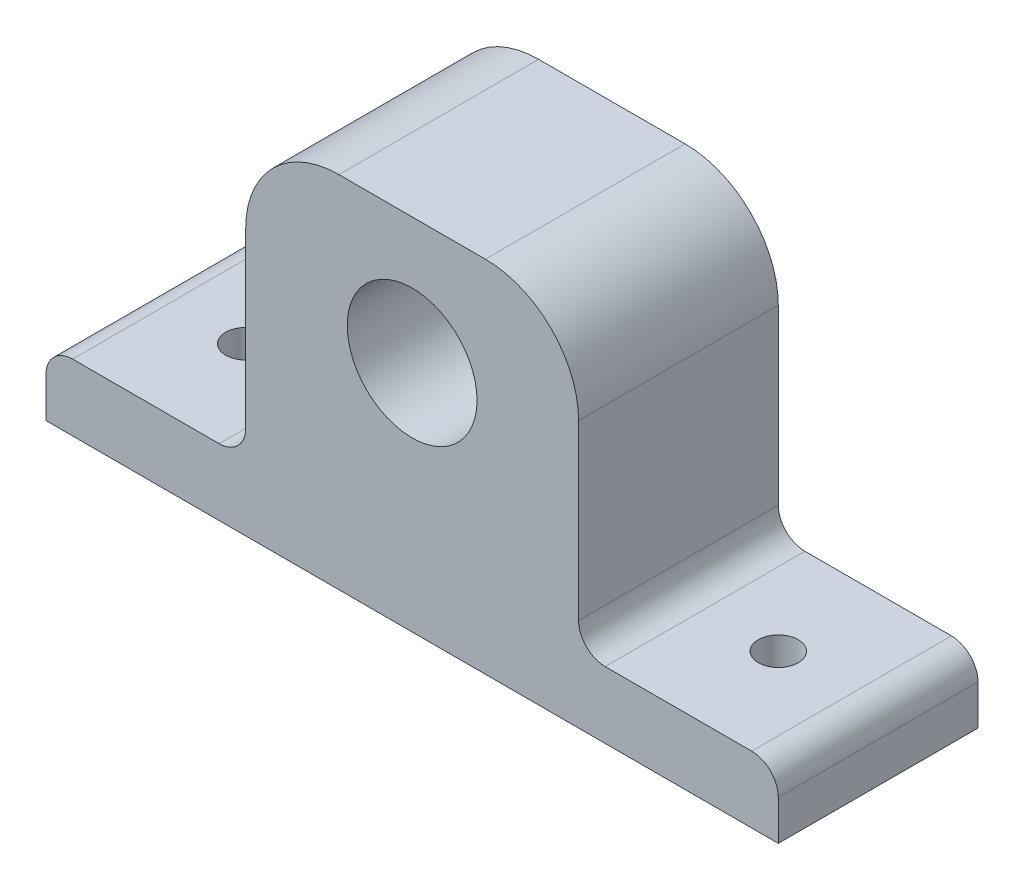
ISO-10303-21;
HEADER;
FILE_DESCRIPTION(('STEP AP214'),'2;1');
FILE_NAME('part.step','',(''),(''),'','','');
FILE_SCHEMA(('AUTOMOTIVE_DESIGN { 1 0 10303 214 1 1 1 1 }'));
ENDSEC;
DATA;
#1=APPLICATION_CONTEXT('core data for automotive mechanical design processes');
#2=APPLICATION_PROTOCOL_DEFINITION('international standard','automotive_design',2000,#1);
#3=PRODUCT_CONTEXT('',#1,'mechanical');
#4=PRODUCT('Part','Part','',(#3));
#5=PRODUCT_RELATED_PRODUCT_CATEGORY('part','',(#4));
#6=PRODUCT_DEFINITION_FORMATION('','',#4);
#7=PRODUCT_DEFINITION_CONTEXT('part definition',#1,'design');
#8=PRODUCT_DEFINITION('design','',#6,#7);
#9=PRODUCT_DEFINITION_SHAPE('','',#8);
#10=(LENGTH_UNIT() NAMED_UNIT(*) SI_UNIT(.MILLI.,.METRE.));
#11=(NAMED_UNIT(*) PLANE_ANGLE_UNIT() SI_UNIT($,.RADIAN.));
#12=(NAMED_UNIT(*) SI_UNIT($,.STERADIAN.) SOLID_ANGLE_UNIT());
#13=UNCERTAINTY_MEASURE_WITH_UNIT(LENGTH_MEASURE(1.E-05),#10,'distance_accuracy_value','');
#14=(GEOMETRIC_REPRESENTATION_CONTEXT(3) GLOBAL_UNCERTAINTY_ASSIGNED_CONTEXT((#13)) GLOBAL_UNIT_ASSIGNED_CONTEXT((#10,
#11,#12)) REPRESENTATION_CONTEXT('',''));
#15=CARTESIAN_POINT('',(0.,0.,0.));
#16=DIRECTION('',(0.,0.,1.));
#17=DIRECTION('',(1.,0.,0.));
#18=AXIS2_PLACEMENT_3D('',#15,#16,#17);
#19=CARTESIAN_POINT('',(-27.5,27.,7.5));
#20=DIRECTION('',(1.,0.,0.));
#21=DIRECTION('',(0.,0.,-1.));
#22=AXIS2_PLACEMENT_3D('',#19,#20,#21);
#23=PLANE('',#22);
#24=DIRECTION('',(0.,-1.,0.));
#25=VECTOR('',#24,1.);
#26=CARTESIAN_POINT('',(-27.5,27.,7.5));
#27=LINE('',#26,#25);
#28=CARTESIAN_POINT('',(-27.5,3.,7.5));
#29=VERTEX_POINT('',#28);
#30=CARTESIAN_POINT('',(-27.5,0.,7.5));
#31=VERTEX_POINT('',#30);
#32=EDGE_CURVE('E193',#29,#31,#27,.T.);
#33=ORIENTED_EDGE('',*,*,#32,.F.);
#34=DIRECTION('',(0.,0.,1.));
#35=VECTOR('',#34,1.);
#36=CARTESIAN_POINT('',(-27.5,3.,-7.5));
#37=LINE('',#36,#35);
#38=CARTESIAN_POINT('',(-27.5,3.,-7.5));
#39=VERTEX_POINT('',#38);
#40=EDGE_CURVE('E237',#29,#39,#37,.F.);
#41=ORIENTED_EDGE('',*,*,#40,.T.);
#42=DIRECTION('',(0.,-1.,0.));
#43=VECTOR('',#42,1.);
#44=CARTESIAN_POINT('',(-27.5,27.,-7.5));
#45=LINE('',#44,#43);
#46=CARTESIAN_POINT('',(-27.5,0.,-7.5));
#47=VERTEX_POINT('',#46);
#48=EDGE_CURVE('E159',#39,#47,#45,.T.);
#49=ORIENTED_EDGE('',*,*,#48,.T.);
#50=DIRECTION('',(0.,0.,1.));
#51=VECTOR('',#50,1.);
#52=CARTESIAN_POINT('',(-27.5,0.,7.5));
#53=LINE('',#52,#51);
#54=EDGE_CURVE('E167',#47,#31,#53,.T.);
#55=ORIENTED_EDGE('',*,*,#54,.T.);
#56=EDGE_LOOP('',(#33,#41,#49,#55));
#57=FACE_BOUND('',#56,.T.);
#58=ADVANCED_FACE('F43',(#57),#23,.F.);
#59=CARTESIAN_POINT('',(27.5,27.,7.5));
#60=DIRECTION('',(-1.,0.,0.));
#61=DIRECTION('',(0.,0.,1.));
#62=AXIS2_PLACEMENT_3D('',#59,#60,#61);
#63=PLANE('',#62);
#64=DIRECTION('',(0.,-1.,0.));
#65=VECTOR('',#64,1.);
#66=CARTESIAN_POINT('',(27.5,27.,-7.5));
#67=LINE('',#66,#65);
#68=CARTESIAN_POINT('',(27.5,3.,-7.5));
#69=VERTEX_POINT('',#68);
#70=CARTESIAN_POINT('',(27.5,0.,-7.5));
#71=VERTEX_POINT('',#70);
#72=EDGE_CURVE('E145',#69,#71,#67,.T.);
#73=ORIENTED_EDGE('',*,*,#72,.F.);
#74=DIRECTION('',(0.,0.,-1.));
#75=VECTOR('',#74,1.);
#76=CARTESIAN_POINT('',(27.5,3.,7.5));
#77=LINE('',#76,#75);
#78=CARTESIAN_POINT('',(27.5,3.,7.5));
#79=VERTEX_POINT('',#78);
#80=EDGE_CURVE('E220',#69,#79,#77,.F.);
#81=ORIENTED_EDGE('',*,*,#80,.T.);
#82=DIRECTION('',(0.,-1.,0.));
#83=VECTOR('',#82,1.);
#84=CARTESIAN_POINT('',(27.5,27.,7.5));
#85=LINE('',#84,#83);
#86=CARTESIAN_POINT('',(27.5,0.,7.5));
#87=VERTEX_POINT('',#86);
#88=EDGE_CURVE('E172',#79,#87,#85,.T.);
#89=ORIENTED_EDGE('',*,*,#88,.T.);
#90=DIRECTION('',(0.,0.,-1.));
#91=VECTOR('',#90,1.);
#92=CARTESIAN_POINT('',(27.5,0.,7.5));
#93=LINE('',#92,#91);
#94=EDGE_CURVE('E165',#87,#71,#93,.T.);
#95=ORIENTED_EDGE('',*,*,#94,.T.);
#96=EDGE_LOOP('',(#73,#81,#89,#95));
#97=FACE_BOUND('',#96,.T.);
#98=ADVANCED_FACE('F170',(#97),#63,.F.);
#99=CARTESIAN_POINT('',(-27.5,27.,-7.5));
#100=DIRECTION('',(0.,0.,1.));
#101=DIRECTION('',(1.,0.,0.));
#102=AXIS2_PLACEMENT_3D('',#99,#100,#101);
#103=PLANE('',#102);
#104=CARTESIAN_POINT('',(0.,17.5,-7.5));
#105=DIRECTION('',(0.,0.,1.));
#106=DIRECTION('',(1.,0.,0.));
#107=AXIS2_PLACEMENT_3D('',#104,#105,#106);
#108=CIRCLE('',#107,4.875);
#109=CARTESIAN_POINT('',(4.875,17.5,-7.5));
#110=VERTEX_POINT('',#109);
#111=EDGE_CURVE('E175',#110,#110,#108,.T.);
#112=ORIENTED_EDGE('',*,*,#111,.T.);
#113=EDGE_LOOP('',(#112));
#114=FACE_BOUND('',#113,.T.);
#115=DIRECTION('',(0.,1.,0.));
#116=VECTOR('',#115,1.);
#117=CARTESIAN_POINT('',(-12.5,5.,-7.5));
#118=LINE('',#117,#116);
#119=CARTESIAN_POINT('',(-12.5,7.,-7.5));
#120=VERTEX_POINT('',#119);
#121=CARTESIAN_POINT('',(-12.5,20.,-7.5));
#122=VERTEX_POINT('',#121);
#123=EDGE_CURVE('E290',#120,#122,#118,.T.);
#124=ORIENTED_EDGE('',*,*,#123,.T.);
#125=CARTESIAN_POINT('',(-5.5,20.,-7.5));
#126=DIRECTION('',(0.,0.,1.));
#127=DIRECTION('',(1.,0.,0.));
#128=AXIS2_PLACEMENT_3D('',#125,#126,#127);
#129=CIRCLE('',#128,7.);
#130=CARTESIAN_POINT('',(-5.5,27.,-7.5));
#131=VERTEX_POINT('',#130);
#132=EDGE_CURVE('E265',#122,#131,#129,.F.);
#133=ORIENTED_EDGE('',*,*,#132,.T.);
#134=DIRECTION('',(-1.,0.,0.));
#135=VECTOR('',#134,1.);
#136=CARTESIAN_POINT('',(-27.5,27.,-7.5));
#137=LINE('',#136,#135);
#138=CARTESIAN_POINT('',(5.50000000000001,27.,-7.5));
#139=VERTEX_POINT('',#138);
#140=EDGE_CURVE('E190',#139,#131,#137,.T.);
#141=ORIENTED_EDGE('',*,*,#140,.F.);
#142=CARTESIAN_POINT('',(5.5,20.,-7.5));
#143=DIRECTION('',(0.,0.,1.));
#144=DIRECTION('',(1.,0.,0.));
#145=AXIS2_PLACEMENT_3D('',#142,#143,#144);
#146=CIRCLE('',#145,7.);
#147=CARTESIAN_POINT('',(12.5,20.,-7.5));
#148=VERTEX_POINT('',#147);
#149=EDGE_CURVE('E262',#139,#148,#146,.F.);
#150=ORIENTED_EDGE('',*,*,#149,.T.);
#151=DIRECTION('',(0.,1.,0.));
#152=VECTOR('',#151,1.);
#153=CARTESIAN_POINT('',(12.5,5.,-7.5));
#154=LINE('',#153,#152);
#155=CARTESIAN_POINT('',(12.5,7.,-7.5));
#156=VERTEX_POINT('',#155);
#157=EDGE_CURVE('E314',#156,#148,#154,.T.);
#158=ORIENTED_EDGE('',*,*,#157,.F.);
#159=CARTESIAN_POINT('',(14.5,7.,-7.5));
#160=DIRECTION('',(0.,0.,1.));
#161=DIRECTION('',(1.,0.,0.));
#162=AXIS2_PLACEMENT_3D('',#159,#160,#161);
#163=CIRCLE('',#162,2.);
#164=CARTESIAN_POINT('',(14.5,5.,-7.5));
#165=VERTEX_POINT('',#164);
#166=EDGE_CURVE('E249',#156,#165,#163,.T.);
#167=ORIENTED_EDGE('',*,*,#166,.T.);
#168=DIRECTION('',(-1.,0.,0.));
#169=VECTOR('',#168,1.);
#170=CARTESIAN_POINT('',(27.5,5.,-7.5));
#171=LINE('',#170,#169);
#172=CARTESIAN_POINT('',(25.5,5.,-7.5));
#173=VERTEX_POINT('',#172);
#174=EDGE_CURVE('E305',#173,#165,#171,.T.);
#175=ORIENTED_EDGE('',*,*,#174,.F.);
#176=CARTESIAN_POINT('',(25.5,3.,-7.5));
#177=DIRECTION('',(0.,0.,1.));
#178=DIRECTION('',(1.,0.,0.));
#179=AXIS2_PLACEMENT_3D('',#176,#177,#178);
#180=CIRCLE('',#179,2.);
#181=EDGE_CURVE('E153',#173,#69,#180,.F.);
#182=ORIENTED_EDGE('',*,*,#181,.T.);
#183=ORIENTED_EDGE('',*,*,#72,.T.);
#184=DIRECTION('',(-1.,0.,0.));
#185=VECTOR('',#184,1.);
#186=CARTESIAN_POINT('',(-27.5,0.,-7.5));
#187=LINE('',#186,#185);
#188=EDGE_CURVE('E150',#71,#47,#187,.T.);
#189=ORIENTED_EDGE('',*,*,#188,.T.);
#190=ORIENTED_EDGE('',*,*,#48,.F.);
#191=CARTESIAN_POINT('',(-25.5,3.,-7.5));
#192=DIRECTION('',(0.,0.,1.));
#193=DIRECTION('',(1.,0.,0.));
#194=AXIS2_PLACEMENT_3D('',#191,#192,#193);
#195=CIRCLE('',#194,2.);
#196=CARTESIAN_POINT('',(-25.5,5.,-7.5));
#197=VERTEX_POINT('',#196);
#198=EDGE_CURVE('E215',#39,#197,#195,.F.);
#199=ORIENTED_EDGE('',*,*,#198,.T.);
#200=DIRECTION('',(-1.,0.,0.));
#201=VECTOR('',#200,1.);
#202=CARTESIAN_POINT('',(-27.5,5.,-7.5));
#203=LINE('',#202,#201);
#204=CARTESIAN_POINT('',(-14.5,5.,-7.5));
#205=VERTEX_POINT('',#204);
#206=EDGE_CURVE('E291',#205,#197,#203,.T.);
#207=ORIENTED_EDGE('',*,*,#206,.F.);
#208=CARTESIAN_POINT('',(-14.5,7.,-7.5));
#209=DIRECTION('',(0.,0.,1.));
#210=DIRECTION('',(1.,0.,0.));
#211=AXIS2_PLACEMENT_3D('',#208,#209,#210);
#212=CIRCLE('',#211,2.);
#213=EDGE_CURVE('E252',#205,#120,#212,.T.);
#214=ORIENTED_EDGE('',*,*,#213,.T.);
#215=EDGE_LOOP('',(#124,#133,#141,#150,#158,#167,#175,#182,#183,#189,#190,#199,#207,#214));
#216=FACE_BOUND('',#215,.T.);
#217=ADVANCED_FACE('F148',(#114,#216),#103,.F.);
#218=CARTESIAN_POINT('',(-27.5,27.,7.5));
#219=DIRECTION('',(0.,0.,-1.));
#220=DIRECTION('',(-1.,0.,0.));
#221=AXIS2_PLACEMENT_3D('',#218,#219,#220);
#222=PLANE('',#221);
#223=CARTESIAN_POINT('',(0.,17.5,7.5));
#224=DIRECTION('',(0.,0.,1.));
#225=DIRECTION('',(1.,0.,0.));
#226=AXIS2_PLACEMENT_3D('',#223,#224,#225);
#227=CIRCLE('',#226,4.875);
#228=CARTESIAN_POINT('',(4.875,17.5,7.5));
#229=VERTEX_POINT('',#228);
#230=EDGE_CURVE('E179',#229,#229,#227,.T.);
#231=ORIENTED_EDGE('',*,*,#230,.F.);
#232=EDGE_LOOP('',(#231));
#233=FACE_BOUND('',#232,.T.);
#234=DIRECTION('',(1.,0.,0.));
#235=VECTOR('',#234,1.);
#236=CARTESIAN_POINT('',(-27.5,27.,7.5));
#237=LINE('',#236,#235);
#238=CARTESIAN_POINT('',(-5.49999999999999,27.,7.5));
#239=VERTEX_POINT('',#238);
#240=CARTESIAN_POINT('',(5.50000000000001,27.,7.5));
#241=VERTEX_POINT('',#240);
#242=EDGE_CURVE('E182',#239,#241,#237,.T.);
#243=ORIENTED_EDGE('',*,*,#242,.F.);
#244=CARTESIAN_POINT('',(-5.5,20.,7.5));
#245=DIRECTION('',(0.,0.,-1.));
#246=DIRECTION('',(-1.,0.,0.));
#247=AXIS2_PLACEMENT_3D('',#244,#245,#246);
#248=CIRCLE('',#247,7.);
#249=CARTESIAN_POINT('',(-12.5,20.,7.5));
#250=VERTEX_POINT('',#249);
#251=EDGE_CURVE('E52',#239,#250,#248,.F.);
#252=ORIENTED_EDGE('',*,*,#251,.T.);
#253=DIRECTION('',(0.,1.,0.));
#254=VECTOR('',#253,1.);
#255=CARTESIAN_POINT('',(-12.5,5.,7.5));
#256=LINE('',#255,#254);
#257=CARTESIAN_POINT('',(-12.5,7.,7.5));
#258=VERTEX_POINT('',#257);
#259=EDGE_CURVE('E280',#258,#250,#256,.T.);
#260=ORIENTED_EDGE('',*,*,#259,.F.);
#261=CARTESIAN_POINT('',(-14.5,7.,7.5));
#262=DIRECTION('',(0.,0.,-1.));
#263=DIRECTION('',(-1.,0.,0.));
#264=AXIS2_PLACEMENT_3D('',#261,#262,#263);
#265=CIRCLE('',#264,2.);
#266=CARTESIAN_POINT('',(-14.5,5.,7.5));
#267=VERTEX_POINT('',#266);
#268=EDGE_CURVE('E255',#258,#267,#265,.T.);
#269=ORIENTED_EDGE('',*,*,#268,.T.);
#270=DIRECTION('',(1.,0.,0.));
#271=VECTOR('',#270,1.);
#272=CARTESIAN_POINT('',(-27.5,5.,7.5));
#273=LINE('',#272,#271);
#274=CARTESIAN_POINT('',(-25.5,5.,7.5));
#275=VERTEX_POINT('',#274);
#276=EDGE_CURVE('E309',#275,#267,#273,.T.);
#277=ORIENTED_EDGE('',*,*,#276,.F.);
#278=CARTESIAN_POINT('',(-25.5,3.,7.5));
#279=DIRECTION('',(0.,0.,-1.));
#280=DIRECTION('',(-1.,0.,0.));
#281=AXIS2_PLACEMENT_3D('',#278,#279,#280);
#282=CIRCLE('',#281,2.);
#283=EDGE_CURVE('E223',#275,#29,#282,.F.);
#284=ORIENTED_EDGE('',*,*,#283,.T.);
#285=ORIENTED_EDGE('',*,*,#32,.T.);
#286=DIRECTION('',(1.,0.,0.));
#287=VECTOR('',#286,1.);
#288=CARTESIAN_POINT('',(-27.5,0.,7.5));
#289=LINE('',#288,#287);
#290=EDGE_CURVE('E187',#31,#87,#289,.T.);
#291=ORIENTED_EDGE('',*,*,#290,.T.);
#292=ORIENTED_EDGE('',*,*,#88,.F.);
#293=CARTESIAN_POINT('',(25.5,3.,7.5));
#294=DIRECTION('',(0.,0.,-1.));
#295=DIRECTION('',(-1.,0.,0.));
#296=AXIS2_PLACEMENT_3D('',#293,#294,#295);
#297=CIRCLE('',#296,2.);
#298=CARTESIAN_POINT('',(25.5,5.,7.5));
#299=VERTEX_POINT('',#298);
#300=EDGE_CURVE('E226',#79,#299,#297,.F.);
#301=ORIENTED_EDGE('',*,*,#300,.T.);
#302=DIRECTION('',(1.,0.,0.));
#303=VECTOR('',#302,1.);
#304=CARTESIAN_POINT('',(27.5,5.,7.5));
#305=LINE('',#304,#303);
#306=CARTESIAN_POINT('',(14.5,5.,7.5));
#307=VERTEX_POINT('',#306);
#308=EDGE_CURVE('E310',#307,#299,#305,.T.);
#309=ORIENTED_EDGE('',*,*,#308,.F.);
#310=CARTESIAN_POINT('',(14.5,7.,7.5));
#311=DIRECTION('',(0.,0.,-1.));
#312=DIRECTION('',(-1.,0.,0.));
#313=AXIS2_PLACEMENT_3D('',#310,#311,#312);
#314=CIRCLE('',#313,2.);
#315=CARTESIAN_POINT('',(12.5,7.,7.5));
#316=VERTEX_POINT('',#315);
#317=EDGE_CURVE('E246',#307,#316,#314,.T.);
#318=ORIENTED_EDGE('',*,*,#317,.T.);
#319=DIRECTION('',(0.,1.,0.));
#320=VECTOR('',#319,1.);
#321=CARTESIAN_POINT('',(12.5,5.,7.5));
#322=LINE('',#321,#320);
#323=CARTESIAN_POINT('',(12.5,20.,7.5));
#324=VERTEX_POINT('',#323);
#325=EDGE_CURVE('E207',#316,#324,#322,.T.);
#326=ORIENTED_EDGE('',*,*,#325,.T.);
#327=CARTESIAN_POINT('',(5.5,20.,7.5));
#328=DIRECTION('',(0.,0.,-1.));
#329=DIRECTION('',(-1.,0.,0.));
#330=AXIS2_PLACEMENT_3D('',#327,#328,#329);
#331=CIRCLE('',#330,7.);
#332=EDGE_CURVE('E59',#324,#241,#331,.F.);
#333=ORIENTED_EDGE('',*,*,#332,.T.);
#334=EDGE_LOOP('',(#243,#252,#260,#269,#277,#284,#285,#291,#292,#301,#309,#318,#326,#333));
#335=FACE_BOUND('',#334,.T.);
#336=ADVANCED_FACE('F279',(#233,#335),#222,.F.);
#337=CARTESIAN_POINT('',(0.,27.,0.));
#338=DIRECTION('',(0.,-1.,0.));
#339=DIRECTION('',(0.,0.,-1.));
#340=AXIS2_PLACEMENT_3D('',#337,#338,#339);
#341=PLANE('',#340);
#342=ORIENTED_EDGE('',*,*,#140,.T.);
#343=DIRECTION('',(0.,0.,-1.));
#344=VECTOR('',#343,1.);
#345=CARTESIAN_POINT('',(-5.5,27.,0.));
#346=LINE('',#345,#344);
#347=EDGE_CURVE('E271',#131,#239,#346,.F.);
#348=ORIENTED_EDGE('',*,*,#347,.T.);
#349=ORIENTED_EDGE('',*,*,#242,.T.);
#350=DIRECTION('',(0.,0.,1.));
#351=VECTOR('',#350,1.);
#352=CARTESIAN_POINT('',(5.5,27.,0.));
#353=LINE('',#352,#351);
#354=EDGE_CURVE('E268',#241,#139,#353,.F.);
#355=ORIENTED_EDGE('',*,*,#354,.T.);
#356=EDGE_LOOP('',(#342,#348,#349,#355));
#357=FACE_BOUND('',#356,.T.);
#358=ADVANCED_FACE('F298',(#357),#341,.F.);
#359=CARTESIAN_POINT('',(0.,0.,0.));
#360=DIRECTION('',(0.,-1.,0.));
#361=DIRECTION('',(0.,0.,-1.));
#362=AXIS2_PLACEMENT_3D('',#359,#360,#361);
#363=PLANE('',#362);
#364=CARTESIAN_POINT('',(-20.,0.,0.));
#365=DIRECTION('',(0.,1.,0.));
#366=DIRECTION('',(0.,0.,1.));
#367=AXIS2_PLACEMENT_3D('',#364,#365,#366);
#368=CIRCLE('',#367,1.5);
#369=CARTESIAN_POINT('',(-20.,0.,1.5));
#370=VERTEX_POINT('',#369);
#371=EDGE_CURVE('E203',#370,#370,#368,.T.);
#372=ORIENTED_EDGE('',*,*,#371,.T.);
#373=EDGE_LOOP('',(#372));
#374=FACE_BOUND('',#373,.T.);
#375=CARTESIAN_POINT('',(20.,0.,0.));
#376=DIRECTION('',(0.,1.,0.));
#377=DIRECTION('',(0.,0.,1.));
#378=AXIS2_PLACEMENT_3D('',#375,#376,#377);
#379=CIRCLE('',#378,1.5);
#380=CARTESIAN_POINT('',(20.,0.,1.5));
#381=VERTEX_POINT('',#380);
#382=EDGE_CURVE('E328',#381,#381,#379,.T.);
#383=ORIENTED_EDGE('',*,*,#382,.T.);
#384=EDGE_LOOP('',(#383));
#385=FACE_BOUND('',#384,.T.);
#386=ORIENTED_EDGE('',*,*,#94,.F.);
#387=ORIENTED_EDGE('',*,*,#290,.F.);
#388=ORIENTED_EDGE('',*,*,#54,.F.);
#389=ORIENTED_EDGE('',*,*,#188,.F.);
#390=EDGE_LOOP('',(#386,#387,#388,#389));
#391=FACE_BOUND('',#390,.T.);
#392=ADVANCED_FACE('F163',(#374,#385,#391),#363,.T.);
#393=CARTESIAN_POINT('',(0.,17.5,-7.5));
#394=DIRECTION('',(0.,0.,1.));
#395=DIRECTION('',(1.,0.,0.));
#396=AXIS2_PLACEMENT_3D('',#393,#394,#395);
#397=CYLINDRICAL_SURFACE('',#396,4.875);
#398=ORIENTED_EDGE('',*,*,#111,.F.);
#399=EDGE_LOOP('',(#398));
#400=FACE_BOUND('',#399,.T.);
#401=ORIENTED_EDGE('',*,*,#230,.T.);
#402=EDGE_LOOP('',(#401));
#403=FACE_BOUND('',#402,.T.);
#404=ADVANCED_FACE('F414',(#400,#403),#397,.F.);
#405=CARTESIAN_POINT('',(12.5,5.,-7.5));
#406=DIRECTION('',(-1.,0.,0.));
#407=DIRECTION('',(0.,0.,1.));
#408=AXIS2_PLACEMENT_3D('',#405,#406,#407);
#409=PLANE('',#408);
#410=ORIENTED_EDGE('',*,*,#157,.T.);
#411=DIRECTION('',(0.,0.,1.));
#412=VECTOR('',#411,1.);
#413=CARTESIAN_POINT('',(12.5,20.,-7.5));
#414=LINE('',#413,#412);
#415=EDGE_CURVE('E11',#148,#324,#414,.T.);
#416=ORIENTED_EDGE('',*,*,#415,.T.);
#417=ORIENTED_EDGE('',*,*,#325,.F.);
#418=DIRECTION('',(0.,0.,1.));
#419=VECTOR('',#418,1.);
#420=CARTESIAN_POINT('',(12.5,7.,-7.5));
#421=LINE('',#420,#419);
#422=EDGE_CURVE('E240',#316,#156,#421,.F.);
#423=ORIENTED_EDGE('',*,*,#422,.T.);
#424=EDGE_LOOP('',(#410,#416,#417,#423));
#425=FACE_BOUND('',#424,.T.);
#426=ADVANCED_FACE('F390',(#425),#409,.F.);
#427=CARTESIAN_POINT('',(0.,5.,0.));
#428=DIRECTION('',(0.,-1.,0.));
#429=DIRECTION('',(0.,0.,-1.));
#430=AXIS2_PLACEMENT_3D('',#427,#428,#429);
#431=PLANE('',#430);
#432=CARTESIAN_POINT('',(20.,5.,0.));
#433=DIRECTION('',(0.,-1.,0.));
#434=DIRECTION('',(0.,0.,-1.));
#435=AXIS2_PLACEMENT_3D('',#432,#433,#434);
#436=CIRCLE('',#435,1.5);
#437=CARTESIAN_POINT('',(20.,5.,-1.5));
#438=VERTEX_POINT('',#437);
#439=EDGE_CURVE('E202',#438,#438,#436,.T.);
#440=ORIENTED_EDGE('',*,*,#439,.T.);
#441=EDGE_LOOP('',(#440));
#442=FACE_BOUND('',#441,.T.);
#443=ORIENTED_EDGE('',*,*,#308,.T.);
#444=DIRECTION('',(0.,0.,-1.));
#445=VECTOR('',#444,1.);
#446=CARTESIAN_POINT('',(25.5,5.,0.));
#447=LINE('',#446,#445);
#448=EDGE_CURVE('E211',#299,#173,#447,.T.);
#449=ORIENTED_EDGE('',*,*,#448,.T.);
#450=ORIENTED_EDGE('',*,*,#174,.T.);
#451=DIRECTION('',(0.,0.,1.));
#452=VECTOR('',#451,1.);
#453=CARTESIAN_POINT('',(14.5,5.,7.5));
#454=LINE('',#453,#452);
#455=EDGE_CURVE('E158',#165,#307,#454,.T.);
#456=ORIENTED_EDGE('',*,*,#455,.T.);
#457=EDGE_LOOP('',(#443,#449,#450,#456));
#458=FACE_BOUND('',#457,.T.);
#459=ADVANCED_FACE('F395',(#442,#458),#431,.F.);
#460=CARTESIAN_POINT('',(-12.5,5.,-7.5));
#461=DIRECTION('',(1.,0.,0.));
#462=DIRECTION('',(0.,0.,-1.));
#463=AXIS2_PLACEMENT_3D('',#460,#461,#462);
#464=PLANE('',#463);
#465=ORIENTED_EDGE('',*,*,#259,.T.);
#466=DIRECTION('',(0.,0.,-1.));
#467=VECTOR('',#466,1.);
#468=CARTESIAN_POINT('',(-12.5,20.,-7.5));
#469=LINE('',#468,#467);
#470=EDGE_CURVE('E258',#250,#122,#469,.T.);
#471=ORIENTED_EDGE('',*,*,#470,.T.);
#472=ORIENTED_EDGE('',*,*,#123,.F.);
#473=DIRECTION('',(0.,0.,-1.));
#474=VECTOR('',#473,1.);
#475=CARTESIAN_POINT('',(-12.5,7.,-7.5));
#476=LINE('',#475,#474);
#477=EDGE_CURVE('E243',#120,#258,#476,.F.);
#478=ORIENTED_EDGE('',*,*,#477,.T.);
#479=EDGE_LOOP('',(#465,#471,#472,#478));
#480=FACE_BOUND('',#479,.T.);
#481=ADVANCED_FACE('F286',(#480),#464,.F.);
#482=CARTESIAN_POINT('',(0.,5.,0.));
#483=DIRECTION('',(0.,1.,0.));
#484=DIRECTION('',(0.,0.,1.));
#485=AXIS2_PLACEMENT_3D('',#482,#483,#484);
#486=PLANE('',#485);
#487=CARTESIAN_POINT('',(-20.,5.,0.));
#488=DIRECTION('',(0.,1.,0.));
#489=DIRECTION('',(0.,0.,1.));
#490=AXIS2_PLACEMENT_3D('',#487,#488,#489);
#491=CIRCLE('',#490,1.5);
#492=CARTESIAN_POINT('',(-20.,5.,1.5));
#493=VERTEX_POINT('',#492);
#494=EDGE_CURVE('E198',#493,#493,#491,.T.);
#495=ORIENTED_EDGE('',*,*,#494,.F.);
#496=EDGE_LOOP('',(#495));
#497=FACE_BOUND('',#496,.T.);
#498=ORIENTED_EDGE('',*,*,#206,.T.);
#499=DIRECTION('',(0.,0.,1.));
#500=VECTOR('',#499,1.);
#501=CARTESIAN_POINT('',(-25.5,5.,7.5));
#502=LINE('',#501,#500);
#503=EDGE_CURVE('E233',#197,#275,#502,.T.);
#504=ORIENTED_EDGE('',*,*,#503,.T.);
#505=ORIENTED_EDGE('',*,*,#276,.T.);
#506=DIRECTION('',(0.,0.,-1.));
#507=VECTOR('',#506,1.);
#508=CARTESIAN_POINT('',(-14.5,5.,0.));
#509=LINE('',#508,#507);
#510=EDGE_CURVE('E229',#267,#205,#509,.T.);
#511=ORIENTED_EDGE('',*,*,#510,.T.);
#512=EDGE_LOOP('',(#498,#504,#505,#511));
#513=FACE_BOUND('',#512,.T.);
#514=ADVANCED_FACE('F341',(#497,#513),#486,.T.);
#515=CARTESIAN_POINT('',(-20.,0.,0.));
#516=DIRECTION('',(0.,1.,0.));
#517=DIRECTION('',(0.,0.,1.));
#518=AXIS2_PLACEMENT_3D('',#515,#516,#517);
#519=CYLINDRICAL_SURFACE('',#518,1.5);
#520=ORIENTED_EDGE('',*,*,#494,.T.);
#521=EDGE_LOOP('',(#520));
#522=FACE_BOUND('',#521,.T.);
#523=ORIENTED_EDGE('',*,*,#371,.F.);
#524=EDGE_LOOP('',(#523));
#525=FACE_BOUND('',#524,.T.);
#526=ADVANCED_FACE('F338',(#522,#525),#519,.F.);
#527=CARTESIAN_POINT('',(20.,0.,0.));
#528=DIRECTION('',(0.,1.,0.));
#529=DIRECTION('',(0.,0.,1.));
#530=AXIS2_PLACEMENT_3D('',#527,#528,#529);
#531=CYLINDRICAL_SURFACE('',#530,1.5);
#532=ORIENTED_EDGE('',*,*,#382,.F.);
#533=EDGE_LOOP('',(#532));
#534=FACE_BOUND('',#533,.T.);
#535=ORIENTED_EDGE('',*,*,#439,.F.);
#536=EDGE_LOOP('',(#535));
#537=FACE_BOUND('',#536,.T.);
#538=ADVANCED_FACE('F340',(#534,#537),#531,.F.);
#539=CARTESIAN_POINT('',(25.5,3.,0.));
#540=DIRECTION('',(0.,0.,-1.));
#541=DIRECTION('',(-1.,0.,0.));
#542=AXIS2_PLACEMENT_3D('',#539,#540,#541);
#543=CYLINDRICAL_SURFACE('',#542,2.);
#544=ORIENTED_EDGE('',*,*,#300,.F.);
#545=ORIENTED_EDGE('',*,*,#80,.F.);
#546=ORIENTED_EDGE('',*,*,#181,.F.);
#547=ORIENTED_EDGE('',*,*,#448,.F.);
#548=EDGE_LOOP('',(#544,#545,#546,#547));
#549=FACE_BOUND('',#548,.T.);
#550=ADVANCED_FACE('F348',(#549),#543,.T.);
#551=CARTESIAN_POINT('',(-25.5,3.,0.));
#552=DIRECTION('',(0.,0.,-1.));
#553=DIRECTION('',(-1.,0.,0.));
#554=AXIS2_PLACEMENT_3D('',#551,#552,#553);
#555=CYLINDRICAL_SURFACE('',#554,2.);
#556=ORIENTED_EDGE('',*,*,#198,.F.);
#557=ORIENTED_EDGE('',*,*,#40,.F.);
#558=ORIENTED_EDGE('',*,*,#283,.F.);
#559=ORIENTED_EDGE('',*,*,#503,.F.);
#560=EDGE_LOOP('',(#556,#557,#558,#559));
#561=FACE_BOUND('',#560,.T.);
#562=ADVANCED_FACE('F369',(#561),#555,.T.);
#563=CARTESIAN_POINT('',(14.5,7.,0.));
#564=DIRECTION('',(0.,0.,-1.));
#565=DIRECTION('',(-1.,0.,0.));
#566=AXIS2_PLACEMENT_3D('',#563,#564,#565);
#567=CYLINDRICAL_SURFACE('',#566,2.);
#568=ORIENTED_EDGE('',*,*,#166,.F.);
#569=ORIENTED_EDGE('',*,*,#422,.F.);
#570=ORIENTED_EDGE('',*,*,#317,.F.);
#571=ORIENTED_EDGE('',*,*,#455,.F.);
#572=EDGE_LOOP('',(#568,#569,#570,#571));
#573=FACE_BOUND('',#572,.T.);
#574=ADVANCED_FACE('F373',(#573),#567,.F.);
#575=CARTESIAN_POINT('',(-14.5,7.,0.));
#576=DIRECTION('',(0.,0.,-1.));
#577=DIRECTION('',(-1.,0.,0.));
#578=AXIS2_PLACEMENT_3D('',#575,#576,#577);
#579=CYLINDRICAL_SURFACE('',#578,2.);
#580=ORIENTED_EDGE('',*,*,#268,.F.);
#581=ORIENTED_EDGE('',*,*,#477,.F.);
#582=ORIENTED_EDGE('',*,*,#213,.F.);
#583=ORIENTED_EDGE('',*,*,#510,.F.);
#584=EDGE_LOOP('',(#580,#581,#582,#583));
#585=FACE_BOUND('',#584,.T.);
#586=ADVANCED_FACE('F377',(#585),#579,.F.);
#587=CARTESIAN_POINT('',(-5.5,20.,-7.5));
#588=DIRECTION('',(0.,0.,-1.));
#589=DIRECTION('',(-1.,0.,0.));
#590=AXIS2_PLACEMENT_3D('',#587,#588,#589);
#591=CYLINDRICAL_SURFACE('',#590,7.);
#592=ORIENTED_EDGE('',*,*,#251,.F.);
#593=ORIENTED_EDGE('',*,*,#347,.F.);
#594=ORIENTED_EDGE('',*,*,#132,.F.);
#595=ORIENTED_EDGE('',*,*,#470,.F.);
#596=EDGE_LOOP('',(#592,#593,#594,#595));
#597=FACE_BOUND('',#596,.T.);
#598=ADVANCED_FACE('F293',(#597),#591,.T.);
#599=CARTESIAN_POINT('',(5.5,20.,-7.5));
#600=DIRECTION('',(0.,0.,1.));
#601=DIRECTION('',(1.,0.,0.));
#602=AXIS2_PLACEMENT_3D('',#599,#600,#601);
#603=CYLINDRICAL_SURFACE('',#602,7.);
#604=ORIENTED_EDGE('',*,*,#149,.F.);
#605=ORIENTED_EDGE('',*,*,#354,.F.);
#606=ORIENTED_EDGE('',*,*,#332,.F.);
#607=ORIENTED_EDGE('',*,*,#415,.F.);
#608=EDGE_LOOP('',(#604,#605,#606,#607));
#609=FACE_BOUND('',#608,.T.);
#610=ADVANCED_FACE('F45',(#609),#603,.T.);
#611=CLOSED_SHELL('',(#58,#98,#217,#336,#358,#392,#404,#426,#459,#481,#514,#526,#538,#550,#562,
#574,#586,#598,#610));
#612=MANIFOLD_SOLID_BREP('B2',#611);
#613=ADVANCED_BREP_SHAPE_REPRESENTATION('',(#18,#612),#14);
#614=SHAPE_DEFINITION_REPRESENTATION(#9,#613);
ENDSEC;
END-ISO-10303-21;
